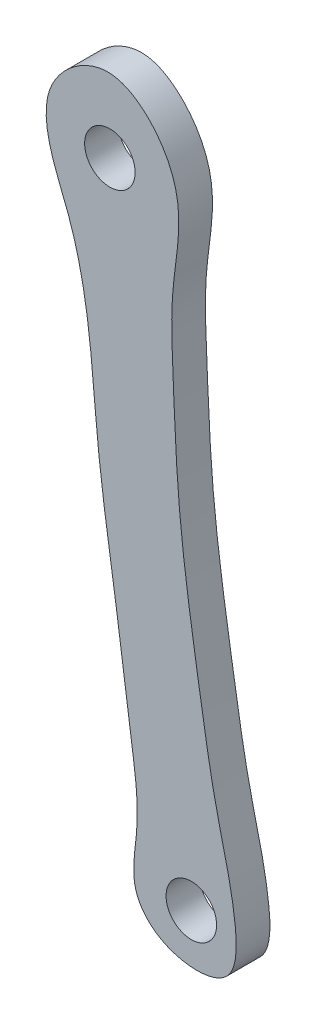
ISO-10303-21;
HEADER;
FILE_DESCRIPTION(('STEP AP214'),'2;1');
FILE_NAME('part.step','',(''),(''),'','','');
FILE_SCHEMA(('AUTOMOTIVE_DESIGN { 1 0 10303 214 1 1 1 1 }'));
ENDSEC;
DATA;
#1=APPLICATION_CONTEXT('core data for automotive mechanical design processes');
#2=APPLICATION_PROTOCOL_DEFINITION('international standard','automotive_design',2000,#1);
#3=PRODUCT_CONTEXT('',#1,'mechanical');
#4=PRODUCT('Part','Part','',(#3));
#5=PRODUCT_RELATED_PRODUCT_CATEGORY('part','',(#4));
#6=PRODUCT_DEFINITION_FORMATION('','',#4);
#7=PRODUCT_DEFINITION_CONTEXT('part definition',#1,'design');
#8=PRODUCT_DEFINITION('design','',#6,#7);
#9=PRODUCT_DEFINITION_SHAPE('','',#8);
#10=(LENGTH_UNIT() NAMED_UNIT(*) SI_UNIT(.MILLI.,.METRE.));
#11=(NAMED_UNIT(*) PLANE_ANGLE_UNIT() SI_UNIT($,.RADIAN.));
#12=(NAMED_UNIT(*) SI_UNIT($,.STERADIAN.) SOLID_ANGLE_UNIT());
#13=UNCERTAINTY_MEASURE_WITH_UNIT(LENGTH_MEASURE(1.E-05),#10,'distance_accuracy_value','');
#14=(GEOMETRIC_REPRESENTATION_CONTEXT(3) GLOBAL_UNCERTAINTY_ASSIGNED_CONTEXT((#13)) GLOBAL_UNIT_ASSIGNED_CONTEXT((#10,
#11,#12)) REPRESENTATION_CONTEXT('',''));
#15=CARTESIAN_POINT('',(0.,0.,0.));
#16=DIRECTION('',(0.,0.,1.));
#17=DIRECTION('',(1.,0.,0.));
#18=AXIS2_PLACEMENT_3D('',#15,#16,#17);
#19=CARTESIAN_POINT('',(34.2052857334553,3.63371797759026,5.82076236533142));
#20=DIRECTION('',(0.,0.,-1.));
#21=DIRECTION('',(-1.,0.,0.));
#22=AXIS2_PLACEMENT_3D('',#19,#20,#21);
#23=PLANE('',#22);
#24=CARTESIAN_POINT('',(31.7131074609484,-5.3104195965543,5.82076236533142));
#25=DIRECTION('',(0.,0.,1.));
#26=DIRECTION('',(1.,0.,0.));
#27=AXIS2_PLACEMENT_3D('',#24,#25,#26);
#28=CIRCLE('',#27,2.38125);
#29=CARTESIAN_POINT('',(34.0943574609484,-5.3104195965543,5.82076236533142));
#30=VERTEX_POINT('',#29);
#31=EDGE_CURVE('E84',#30,#30,#28,.T.);
#32=ORIENTED_EDGE('',*,*,#31,.F.);
#33=EDGE_LOOP('',(#32));
#34=FACE_BOUND('',#33,.T.);
#35=CARTESIAN_POINT('',(24.035518381684,52.2825932798351,5.82076236533142));
#36=DIRECTION('',(0.,0.,1.));
#37=DIRECTION('',(1.,0.,0.));
#38=AXIS2_PLACEMENT_3D('',#35,#36,#37);
#39=CIRCLE('',#38,2.38125);
#40=CARTESIAN_POINT('',(26.416768381684,52.2825932798351,5.82076236533142));
#41=VERTEX_POINT('',#40);
#42=EDGE_CURVE('E75',#41,#41,#39,.T.);
#43=ORIENTED_EDGE('',*,*,#42,.F.);
#44=EDGE_LOOP('',(#43));
#45=FACE_BOUND('',#44,.T.);
#46=CARTESIAN_POINT('',(20.0814184350668,45.8149112381343,5.82076236533142));
#47=CARTESIAN_POINT('',(19.6495708274102,46.9851695900627,5.82076236533142));
#48=CARTESIAN_POINT('',(18.3336759656446,49.9045563243301,5.82076236533142));
#49=CARTESIAN_POINT('',(17.2166086389992,55.8251028596601,5.82076236533142));
#50=CARTESIAN_POINT('',(23.5262125071874,60.6378511533715,5.82076236533142));
#51=CARTESIAN_POINT('',(28.6252329805957,56.9473638897645,5.82076236533142));
#52=CARTESIAN_POINT('',(31.2541336164792,51.364667918234,5.82076236533142));
#53=CARTESIAN_POINT('',(29.6898371996547,44.9289043718127,5.82076236533142));
#54=CARTESIAN_POINT('',(30.0395267907528,36.355403610082,5.82076236533142));
#55=CARTESIAN_POINT('',(30.4320647194194,25.806481547809,5.82076236533142));
#56=CARTESIAN_POINT('',(32.2642078977138,14.4307866223769,5.82076236533142));
#57=CARTESIAN_POINT('',(33.927428942102,4.10199774501329,5.82076236533142));
#58=CARTESIAN_POINT('',(35.8341713467766,-2.48669004646583,5.82076236533142));
#59=CARTESIAN_POINT('',(36.295698712144,-10.3940542851569,5.82076236533142));
#60=CARTESIAN_POINT('',(29.2329873956679,-10.1430340927612,5.82076236533142));
#61=CARTESIAN_POINT('',(25.7068078943383,-6.16289716355628,5.82076236533142));
#62=CARTESIAN_POINT('',(27.03977717472,-0.505916225831989,5.82076236533142));
#63=CARTESIAN_POINT('',(25.95413229602,6.13328409452745,5.82076236533142));
#64=CARTESIAN_POINT('',(24.7142171991881,15.9886621937794,5.82076236533142));
#65=CARTESIAN_POINT('',(22.7334819017097,27.3695582361436,5.82076236533142));
#66=CARTESIAN_POINT('',(22.2229596623829,38.2027090155912,5.82076236533142));
#67=CARTESIAN_POINT('',(20.7394959478357,44.0315953371546,5.82076236533142));
#68=CARTESIAN_POINT('',(20.0814184350668,45.8149112381343,5.82076236533142));
#69=B_SPLINE_CURVE_WITH_KNOTS('',3,(#46,#47,#48,#49,#50,#51,#52,#53,#54,#55,#56,#57,#58,#59,#60,
#61,#62,#63,#64,#65,#66,#67,#68),.UNSPECIFIED.,.T.,.F.,(4,1,1,1,1,1,1,1,1,1,1,1,1,1,1,1,1,1,1,1,
4),(0.,0.0250124190796352,0.0645605261207851,0.109824748172424,0.141829133797859,
0.174904668293526,0.228683643126827,0.267293064368555,0.346435132809227,0.437989456312868,
0.498221984546656,0.55052380022169,0.584937846142799,0.626250706495607,0.649142589323526,
0.684160436496256,0.731884131559613,0.784455011044328,0.881469071145699,0.961884446632506,1.),.UNSPECIFIED.);
#70=CARTESIAN_POINT('',(20.0814184350668,45.8149112381343,5.82076236533142));
#71=VERTEX_POINT('',#70);
#72=EDGE_CURVE('E11',#71,#71,#69,.T.);
#73=ORIENTED_EDGE('',*,*,#72,.F.);
#74=EDGE_LOOP('',(#73));
#75=FACE_BOUND('',#74,.T.);
#76=ADVANCED_FACE('F57',(#34,#45,#75),#23,.F.);
#77=CARTESIAN_POINT('',(34.2052857334553,3.63371797759026,2.64576236533142));
#78=DIRECTION('',(0.,0.,-1.));
#79=DIRECTION('',(-1.,0.,0.));
#80=AXIS2_PLACEMENT_3D('',#77,#78,#79);
#81=PLANE('',#80);
#82=CARTESIAN_POINT('',(31.7131074609484,-5.3104195965543,2.64576236533142));
#83=DIRECTION('',(0.,0.,1.));
#84=DIRECTION('',(1.,0.,0.));
#85=AXIS2_PLACEMENT_3D('',#82,#83,#84);
#86=CIRCLE('',#85,2.38125);
#87=CARTESIAN_POINT('',(34.0943574609484,-5.3104195965543,2.64576236533142));
#88=VERTEX_POINT('',#87);
#89=EDGE_CURVE('E81',#88,#88,#86,.T.);
#90=ORIENTED_EDGE('',*,*,#89,.T.);
#91=EDGE_LOOP('',(#90));
#92=FACE_BOUND('',#91,.T.);
#93=CARTESIAN_POINT('',(24.035518381684,52.2825932798351,2.64576236533142));
#94=DIRECTION('',(0.,0.,1.));
#95=DIRECTION('',(1.,0.,0.));
#96=AXIS2_PLACEMENT_3D('',#93,#94,#95);
#97=CIRCLE('',#96,2.38125);
#98=CARTESIAN_POINT('',(26.416768381684,52.2825932798351,2.64576236533142));
#99=VERTEX_POINT('',#98);
#100=EDGE_CURVE('E70',#99,#99,#97,.T.);
#101=ORIENTED_EDGE('',*,*,#100,.T.);
#102=EDGE_LOOP('',(#101));
#103=FACE_BOUND('',#102,.T.);
#104=CARTESIAN_POINT('',(20.0814184350668,45.8149112381343,2.64576236533142));
#105=CARTESIAN_POINT('',(19.6495708274102,46.9851695900627,2.64576236533142));
#106=CARTESIAN_POINT('',(18.3336759656446,49.9045563243301,2.64576236533142));
#107=CARTESIAN_POINT('',(17.2166086389992,55.8251028596601,2.64576236533142));
#108=CARTESIAN_POINT('',(23.5262125071874,60.6378511533715,2.64576236533142));
#109=CARTESIAN_POINT('',(28.6252329805957,56.9473638897645,2.64576236533142));
#110=CARTESIAN_POINT('',(31.2541336164792,51.364667918234,2.64576236533142));
#111=CARTESIAN_POINT('',(29.6898371996547,44.9289043718127,2.64576236533142));
#112=CARTESIAN_POINT('',(30.0395267907528,36.355403610082,2.64576236533142));
#113=CARTESIAN_POINT('',(30.4320647194194,25.806481547809,2.64576236533142));
#114=CARTESIAN_POINT('',(32.2642078977138,14.4307866223769,2.64576236533142));
#115=CARTESIAN_POINT('',(33.927428942102,4.10199774501329,2.64576236533142));
#116=CARTESIAN_POINT('',(35.8341713467766,-2.48669004646583,2.64576236533142));
#117=CARTESIAN_POINT('',(36.295698712144,-10.3940542851569,2.64576236533142));
#118=CARTESIAN_POINT('',(29.2329873956679,-10.1430340927612,2.64576236533142));
#119=CARTESIAN_POINT('',(25.7068078943383,-6.16289716355628,2.64576236533142));
#120=CARTESIAN_POINT('',(27.03977717472,-0.505916225831989,2.64576236533142));
#121=CARTESIAN_POINT('',(25.95413229602,6.13328409452745,2.64576236533142));
#122=CARTESIAN_POINT('',(24.7142171991881,15.9886621937794,2.64576236533142));
#123=CARTESIAN_POINT('',(22.7334819017097,27.3695582361436,2.64576236533142));
#124=CARTESIAN_POINT('',(22.2229596623829,38.2027090155912,2.64576236533142));
#125=CARTESIAN_POINT('',(20.7394959478357,44.0315953371546,2.64576236533142));
#126=CARTESIAN_POINT('',(20.0814184350668,45.8149112381343,2.64576236533142));
#127=B_SPLINE_CURVE_WITH_KNOTS('',3,(#104,#105,#106,#107,#108,#109,#110,#111,#112,#113,#114,
#115,#116,#117,#118,#119,#120,#121,#122,#123,#124,#125,#126),.UNSPECIFIED.,.T.,.F.,(4,1,1,1,1,1,
1,1,1,1,1,1,1,1,1,1,1,1,1,1,4),(0.,0.0250124190796352,0.0645605261207851,0.109824748172424,
0.141829133797859,0.174904668293526,0.228683643126827,0.267293064368555,0.346435132809227,
0.437989456312868,0.498221984546656,0.55052380022169,0.584937846142799,0.626250706495607,
0.649142589323526,0.684160436496256,0.731884131559613,0.784455011044328,0.881469071145699,
0.961884446632506,1.),.UNSPECIFIED.);
#128=CARTESIAN_POINT('',(20.0814184350668,45.8149112381343,2.64576236533142));
#129=VERTEX_POINT('',#128);
#130=EDGE_CURVE('E62',#129,#129,#127,.T.);
#131=ORIENTED_EDGE('',*,*,#130,.T.);
#132=EDGE_LOOP('',(#131));
#133=FACE_BOUND('',#132,.T.);
#134=ADVANCED_FACE('F90',(#92,#103,#133),#81,.T.);
#135=DIRECTION('',(0.,0.,-1.));
#136=VECTOR('',#135,1.);
#137=SURFACE_OF_LINEAR_EXTRUSION('',#69,#136);
#138=ORIENTED_EDGE('',*,*,#72,.T.);
#139=EDGE_LOOP('',(#138));
#140=FACE_BOUND('',#139,.T.);
#141=ORIENTED_EDGE('',*,*,#130,.F.);
#142=EDGE_LOOP('',(#141));
#143=FACE_BOUND('',#142,.T.);
#144=ADVANCED_FACE('F59',(#140,#143),#137,.T.);
#145=CARTESIAN_POINT('',(24.035518381684,52.2825932798351,2.64576236533142));
#146=DIRECTION('',(0.,0.,1.));
#147=DIRECTION('',(1.,0.,0.));
#148=AXIS2_PLACEMENT_3D('',#145,#146,#147);
#149=CYLINDRICAL_SURFACE('',#148,2.38125);
#150=ORIENTED_EDGE('',*,*,#100,.F.);
#151=EDGE_LOOP('',(#150));
#152=FACE_BOUND('',#151,.T.);
#153=ORIENTED_EDGE('',*,*,#42,.T.);
#154=EDGE_LOOP('',(#153));
#155=FACE_BOUND('',#154,.T.);
#156=ADVANCED_FACE('F96',(#152,#155),#149,.F.);
#157=CARTESIAN_POINT('',(31.7131074609484,-5.3104195965543,2.64576236533142));
#158=DIRECTION('',(0.,0.,1.));
#159=DIRECTION('',(1.,0.,0.));
#160=AXIS2_PLACEMENT_3D('',#157,#158,#159);
#161=CYLINDRICAL_SURFACE('',#160,2.38125);
#162=ORIENTED_EDGE('',*,*,#89,.F.);
#163=EDGE_LOOP('',(#162));
#164=FACE_BOUND('',#163,.T.);
#165=ORIENTED_EDGE('',*,*,#31,.T.);
#166=EDGE_LOOP('',(#165));
#167=FACE_BOUND('',#166,.T.);
#168=ADVANCED_FACE('F93',(#164,#167),#161,.F.);
#169=CLOSED_SHELL('',(#76,#134,#144,#156,#168));
#170=MANIFOLD_SOLID_BREP('B2',#169);
#171=ADVANCED_BREP_SHAPE_REPRESENTATION('',(#18,#170),#14);
#172=SHAPE_DEFINITION_REPRESENTATION(#9,#171);
ENDSEC;
END-ISO-10303-21;
